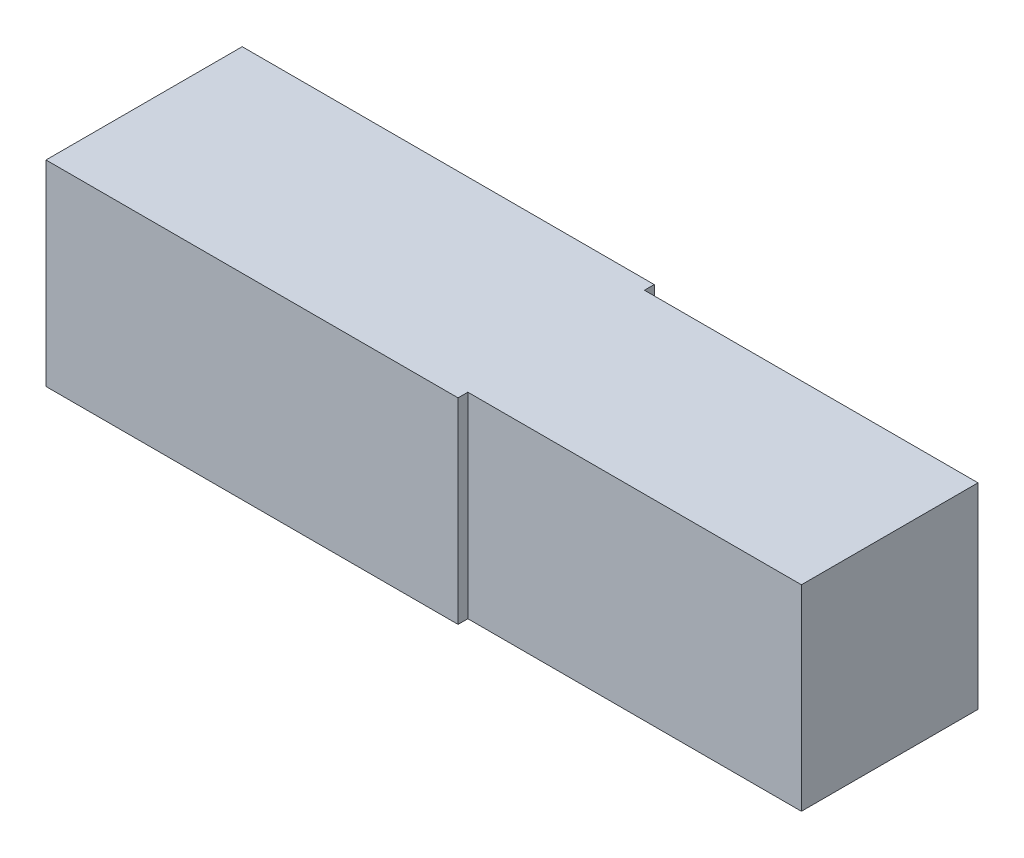
ISO-10303-21;
HEADER;
FILE_DESCRIPTION(('STEP AP214'),'2;1');
FILE_NAME('part.step','',(''),(''),'','','');
FILE_SCHEMA(('AUTOMOTIVE_DESIGN { 1 0 10303 214 1 1 1 1 }'));
ENDSEC;
DATA;
#1=APPLICATION_CONTEXT('core data for automotive mechanical design processes');
#2=APPLICATION_PROTOCOL_DEFINITION('international standard','automotive_design',2000,#1);
#3=PRODUCT_CONTEXT('',#1,'mechanical');
#4=PRODUCT('Part','Part','',(#3));
#5=PRODUCT_RELATED_PRODUCT_CATEGORY('part','',(#4));
#6=PRODUCT_DEFINITION_FORMATION('','',#4);
#7=PRODUCT_DEFINITION_CONTEXT('part definition',#1,'design');
#8=PRODUCT_DEFINITION('design','',#6,#7);
#9=PRODUCT_DEFINITION_SHAPE('','',#8);
#10=(LENGTH_UNIT() NAMED_UNIT(*) SI_UNIT(.MILLI.,.METRE.));
#11=(NAMED_UNIT(*) PLANE_ANGLE_UNIT() SI_UNIT($,.RADIAN.));
#12=(NAMED_UNIT(*) SI_UNIT($,.STERADIAN.) SOLID_ANGLE_UNIT());
#13=UNCERTAINTY_MEASURE_WITH_UNIT(LENGTH_MEASURE(1.E-05),#10,'distance_accuracy_value','');
#14=(GEOMETRIC_REPRESENTATION_CONTEXT(3) GLOBAL_UNCERTAINTY_ASSIGNED_CONTEXT((#13)) GLOBAL_UNIT_ASSIGNED_CONTEXT((#10,
#11,#12)) REPRESENTATION_CONTEXT('',''));
#15=CARTESIAN_POINT('',(0.,0.,0.));
#16=DIRECTION('',(0.,0.,1.));
#17=DIRECTION('',(1.,0.,0.));
#18=AXIS2_PLACEMENT_3D('',#15,#16,#17);
#19=CARTESIAN_POINT('',(-10.5,10.,5.));
#20=DIRECTION('',(-1.,0.,0.));
#21=DIRECTION('',(0.,0.,1.));
#22=AXIS2_PLACEMENT_3D('',#19,#20,#21);
#23=PLANE('',#22);
#24=DIRECTION('',(0.,0.,-1.));
#25=VECTOR('',#24,1.);
#26=CARTESIAN_POINT('',(-10.5,0.,5.));
#27=LINE('',#26,#25);
#28=CARTESIAN_POINT('',(-10.5,0.,5.));
#29=VERTEX_POINT('',#28);
#30=CARTESIAN_POINT('',(-10.5,0.,-5.));
#31=VERTEX_POINT('',#30);
#32=EDGE_CURVE('E104',#29,#31,#27,.T.);
#33=ORIENTED_EDGE('',*,*,#32,.F.);
#34=DIRECTION('',(0.,-1.,0.));
#35=VECTOR('',#34,1.);
#36=CARTESIAN_POINT('',(-10.5,10.,5.));
#37=LINE('',#36,#35);
#38=CARTESIAN_POINT('',(-10.5,10.,5.));
#39=VERTEX_POINT('',#38);
#40=EDGE_CURVE('E103',#39,#29,#37,.T.);
#41=ORIENTED_EDGE('',*,*,#40,.F.);
#42=DIRECTION('',(0.,0.,-1.));
#43=VECTOR('',#42,1.);
#44=CARTESIAN_POINT('',(-10.5,10.,5.));
#45=LINE('',#44,#43);
#46=CARTESIAN_POINT('',(-10.5,10.,-5.));
#47=VERTEX_POINT('',#46);
#48=EDGE_CURVE('E120',#39,#47,#45,.T.);
#49=ORIENTED_EDGE('',*,*,#48,.T.);
#50=DIRECTION('',(0.,-1.,0.));
#51=VECTOR('',#50,1.);
#52=CARTESIAN_POINT('',(-10.5,10.,-5.));
#53=LINE('',#52,#51);
#54=EDGE_CURVE('E129',#47,#31,#53,.T.);
#55=ORIENTED_EDGE('',*,*,#54,.T.);
#56=EDGE_LOOP('',(#33,#41,#49,#55));
#57=FACE_BOUND('',#56,.T.);
#58=ADVANCED_FACE('F39',(#57),#23,.T.);
#59=CARTESIAN_POINT('',(-10.5,10.,5.));
#60=DIRECTION('',(0.,0.,-1.));
#61=DIRECTION('',(-1.,0.,0.));
#62=AXIS2_PLACEMENT_3D('',#59,#60,#61);
#63=PLANE('',#62);
#64=DIRECTION('',(1.,0.,0.));
#65=VECTOR('',#64,1.);
#66=CARTESIAN_POINT('',(-10.5,0.,5.));
#67=LINE('',#66,#65);
#68=CARTESIAN_POINT('',(10.5,0.,5.));
#69=VERTEX_POINT('',#68);
#70=EDGE_CURVE('E117',#29,#69,#67,.T.);
#71=ORIENTED_EDGE('',*,*,#70,.T.);
#72=DIRECTION('',(0.,-1.,0.));
#73=VECTOR('',#72,1.);
#74=CARTESIAN_POINT('',(10.5,10.,5.));
#75=LINE('',#74,#73);
#76=CARTESIAN_POINT('',(10.5,10.,5.));
#77=VERTEX_POINT('',#76);
#78=EDGE_CURVE('E123',#77,#69,#75,.T.);
#79=ORIENTED_EDGE('',*,*,#78,.F.);
#80=DIRECTION('',(1.,0.,0.));
#81=VECTOR('',#80,1.);
#82=CARTESIAN_POINT('',(-10.5,10.,5.));
#83=LINE('',#82,#81);
#84=EDGE_CURVE('E111',#39,#77,#83,.T.);
#85=ORIENTED_EDGE('',*,*,#84,.F.);
#86=ORIENTED_EDGE('',*,*,#40,.T.);
#87=EDGE_LOOP('',(#71,#79,#85,#86));
#88=FACE_BOUND('',#87,.T.);
#89=ADVANCED_FACE('F152',(#88),#63,.F.);
#90=CARTESIAN_POINT('',(-10.5,10.,-5.));
#91=DIRECTION('',(0.,0.,-1.));
#92=DIRECTION('',(-1.,0.,0.));
#93=AXIS2_PLACEMENT_3D('',#90,#91,#92);
#94=PLANE('',#93);
#95=DIRECTION('',(1.,0.,0.));
#96=VECTOR('',#95,1.);
#97=CARTESIAN_POINT('',(-10.5,0.,-5.));
#98=LINE('',#97,#96);
#99=CARTESIAN_POINT('',(10.5,0.,-5.));
#100=VERTEX_POINT('',#99);
#101=EDGE_CURVE('E105',#31,#100,#98,.T.);
#102=ORIENTED_EDGE('',*,*,#101,.F.);
#103=ORIENTED_EDGE('',*,*,#54,.F.);
#104=DIRECTION('',(1.,0.,0.));
#105=VECTOR('',#104,1.);
#106=CARTESIAN_POINT('',(-10.5,10.,-5.));
#107=LINE('',#106,#105);
#108=CARTESIAN_POINT('',(10.5,10.,-5.));
#109=VERTEX_POINT('',#108);
#110=EDGE_CURVE('E174',#47,#109,#107,.T.);
#111=ORIENTED_EDGE('',*,*,#110,.T.);
#112=DIRECTION('',(0.,-1.,0.));
#113=VECTOR('',#112,1.);
#114=CARTESIAN_POINT('',(10.5,10.,-5.));
#115=LINE('',#114,#113);
#116=EDGE_CURVE('E126',#109,#100,#115,.T.);
#117=ORIENTED_EDGE('',*,*,#116,.T.);
#118=EDGE_LOOP('',(#102,#103,#111,#117));
#119=FACE_BOUND('',#118,.T.);
#120=ADVANCED_FACE('F183',(#119),#94,.T.);
#121=CARTESIAN_POINT('',(0.,0.,0.));
#122=DIRECTION('',(0.,-1.,0.));
#123=DIRECTION('',(0.,0.,-1.));
#124=AXIS2_PLACEMENT_3D('',#121,#122,#123);
#125=PLANE('',#124);
#126=ORIENTED_EDGE('',*,*,#32,.T.);
#127=ORIENTED_EDGE('',*,*,#101,.T.);
#128=DIRECTION('',(0.,0.,-1.));
#129=VECTOR('',#128,1.);
#130=CARTESIAN_POINT('',(10.5,0.,5.));
#131=LINE('',#130,#129);
#132=CARTESIAN_POINT('',(10.5,0.,-4.5));
#133=VERTEX_POINT('',#132);
#134=EDGE_CURVE('E96',#133,#100,#131,.T.);
#135=ORIENTED_EDGE('',*,*,#134,.F.);
#136=DIRECTION('',(1.,0.,0.));
#137=VECTOR('',#136,1.);
#138=CARTESIAN_POINT('',(10.5,0.,-4.5));
#139=LINE('',#138,#137);
#140=CARTESIAN_POINT('',(27.5,0.,-4.5));
#141=VERTEX_POINT('',#140);
#142=EDGE_CURVE('E80',#133,#141,#139,.T.);
#143=ORIENTED_EDGE('',*,*,#142,.T.);
#144=DIRECTION('',(0.,0.,1.));
#145=VECTOR('',#144,1.);
#146=CARTESIAN_POINT('',(27.5,0.,-4.5));
#147=LINE('',#146,#145);
#148=CARTESIAN_POINT('',(27.5,0.,4.5));
#149=VERTEX_POINT('',#148);
#150=EDGE_CURVE('E86',#141,#149,#147,.T.);
#151=ORIENTED_EDGE('',*,*,#150,.T.);
#152=DIRECTION('',(1.,0.,0.));
#153=VECTOR('',#152,1.);
#154=CARTESIAN_POINT('',(10.5,0.,4.5));
#155=LINE('',#154,#153);
#156=CARTESIAN_POINT('',(10.5,0.,4.5));
#157=VERTEX_POINT('',#156);
#158=EDGE_CURVE('E90',#157,#149,#155,.T.);
#159=ORIENTED_EDGE('',*,*,#158,.F.);
#160=EDGE_CURVE('E114',#69,#157,#131,.T.);
#161=ORIENTED_EDGE('',*,*,#160,.F.);
#162=ORIENTED_EDGE('',*,*,#70,.F.);
#163=EDGE_LOOP('',(#126,#127,#135,#143,#151,#159,#161,#162));
#164=FACE_BOUND('',#163,.T.);
#165=ADVANCED_FACE('F93',(#164),#125,.T.);
#166=CARTESIAN_POINT('',(0.,10.,0.));
#167=DIRECTION('',(0.,-1.,0.));
#168=DIRECTION('',(0.,0.,-1.));
#169=AXIS2_PLACEMENT_3D('',#166,#167,#168);
#170=PLANE('',#169);
#171=ORIENTED_EDGE('',*,*,#48,.F.);
#172=ORIENTED_EDGE('',*,*,#84,.T.);
#173=DIRECTION('',(0.,0.,-1.));
#174=VECTOR('',#173,1.);
#175=CARTESIAN_POINT('',(10.5,10.,5.));
#176=LINE('',#175,#174);
#177=CARTESIAN_POINT('',(10.5,10.,4.5));
#178=VERTEX_POINT('',#177);
#179=EDGE_CURVE('E146',#77,#178,#176,.T.);
#180=ORIENTED_EDGE('',*,*,#179,.T.);
#181=DIRECTION('',(1.,0.,0.));
#182=VECTOR('',#181,1.);
#183=CARTESIAN_POINT('',(10.5,10.,4.5));
#184=LINE('',#183,#182);
#185=CARTESIAN_POINT('',(27.5,10.,4.5));
#186=VERTEX_POINT('',#185);
#187=EDGE_CURVE('E97',#178,#186,#184,.T.);
#188=ORIENTED_EDGE('',*,*,#187,.T.);
#189=DIRECTION('',(0.,0.,1.));
#190=VECTOR('',#189,1.);
#191=CARTESIAN_POINT('',(27.5,10.,-4.5));
#192=LINE('',#191,#190);
#193=CARTESIAN_POINT('',(27.5,10.,-4.5));
#194=VERTEX_POINT('',#193);
#195=EDGE_CURVE('E99',#194,#186,#192,.T.);
#196=ORIENTED_EDGE('',*,*,#195,.F.);
#197=DIRECTION('',(1.,0.,0.));
#198=VECTOR('',#197,1.);
#199=CARTESIAN_POINT('',(10.5,10.,-4.5));
#200=LINE('',#199,#198);
#201=CARTESIAN_POINT('',(10.5,10.,-4.5));
#202=VERTEX_POINT('',#201);
#203=EDGE_CURVE('E82',#202,#194,#200,.T.);
#204=ORIENTED_EDGE('',*,*,#203,.F.);
#205=EDGE_CURVE('E171',#202,#109,#176,.T.);
#206=ORIENTED_EDGE('',*,*,#205,.T.);
#207=ORIENTED_EDGE('',*,*,#110,.F.);
#208=EDGE_LOOP('',(#171,#172,#180,#188,#196,#204,#206,#207));
#209=FACE_BOUND('',#208,.T.);
#210=ADVANCED_FACE('F181',(#209),#170,.F.);
#211=CARTESIAN_POINT('',(10.5,10.,5.));
#212=DIRECTION('',(-1.,0.,0.));
#213=DIRECTION('',(0.,0.,1.));
#214=AXIS2_PLACEMENT_3D('',#211,#212,#213);
#215=PLANE('',#214);
#216=ORIENTED_EDGE('',*,*,#205,.F.);
#217=DIRECTION('',(0.,-1.,0.));
#218=VECTOR('',#217,1.);
#219=CARTESIAN_POINT('',(10.5,10.,-4.5));
#220=LINE('',#219,#218);
#221=EDGE_CURVE('E48',#202,#133,#220,.T.);
#222=ORIENTED_EDGE('',*,*,#221,.T.);
#223=ORIENTED_EDGE('',*,*,#134,.T.);
#224=ORIENTED_EDGE('',*,*,#116,.F.);
#225=EDGE_LOOP('',(#216,#222,#223,#224));
#226=FACE_BOUND('',#225,.T.);
#227=ADVANCED_FACE('F169',(#226),#215,.F.);
#228=DIRECTION('',(0.,-1.,0.));
#229=VECTOR('',#228,1.);
#230=CARTESIAN_POINT('',(10.5,10.,4.5));
#231=LINE('',#230,#229);
#232=EDGE_CURVE('E11',#178,#157,#231,.T.);
#233=ORIENTED_EDGE('',*,*,#232,.F.);
#234=ORIENTED_EDGE('',*,*,#179,.F.);
#235=ORIENTED_EDGE('',*,*,#78,.T.);
#236=ORIENTED_EDGE('',*,*,#160,.T.);
#237=EDGE_LOOP('',(#233,#234,#235,#236));
#238=FACE_BOUND('',#237,.T.);
#239=ADVANCED_FACE('F141',(#238),#215,.F.);
#240=CARTESIAN_POINT('',(27.5,10.,-4.5));
#241=DIRECTION('',(1.,0.,0.));
#242=DIRECTION('',(0.,0.,-1.));
#243=AXIS2_PLACEMENT_3D('',#240,#241,#242);
#244=PLANE('',#243);
#245=ORIENTED_EDGE('',*,*,#150,.F.);
#246=DIRECTION('',(0.,-1.,0.));
#247=VECTOR('',#246,1.);
#248=CARTESIAN_POINT('',(27.5,10.,-4.5));
#249=LINE('',#248,#247);
#250=EDGE_CURVE('E77',#194,#141,#249,.T.);
#251=ORIENTED_EDGE('',*,*,#250,.F.);
#252=ORIENTED_EDGE('',*,*,#195,.T.);
#253=DIRECTION('',(0.,-1.,0.));
#254=VECTOR('',#253,1.);
#255=CARTESIAN_POINT('',(27.5,10.,4.5));
#256=LINE('',#255,#254);
#257=EDGE_CURVE('E74',#186,#149,#256,.T.);
#258=ORIENTED_EDGE('',*,*,#257,.T.);
#259=EDGE_LOOP('',(#245,#251,#252,#258));
#260=FACE_BOUND('',#259,.T.);
#261=ADVANCED_FACE('F87',(#260),#244,.T.);
#262=CARTESIAN_POINT('',(10.5,10.,-4.5));
#263=DIRECTION('',(0.,0.,-1.));
#264=DIRECTION('',(-1.,0.,0.));
#265=AXIS2_PLACEMENT_3D('',#262,#263,#264);
#266=PLANE('',#265);
#267=ORIENTED_EDGE('',*,*,#142,.F.);
#268=ORIENTED_EDGE('',*,*,#221,.F.);
#269=ORIENTED_EDGE('',*,*,#203,.T.);
#270=ORIENTED_EDGE('',*,*,#250,.T.);
#271=EDGE_LOOP('',(#267,#268,#269,#270));
#272=FACE_BOUND('',#271,.T.);
#273=ADVANCED_FACE('F78',(#272),#266,.T.);
#274=CARTESIAN_POINT('',(10.5,10.,4.5));
#275=DIRECTION('',(0.,0.,-1.));
#276=DIRECTION('',(-1.,0.,0.));
#277=AXIS2_PLACEMENT_3D('',#274,#275,#276);
#278=PLANE('',#277);
#279=ORIENTED_EDGE('',*,*,#158,.T.);
#280=ORIENTED_EDGE('',*,*,#257,.F.);
#281=ORIENTED_EDGE('',*,*,#187,.F.);
#282=ORIENTED_EDGE('',*,*,#232,.T.);
#283=EDGE_LOOP('',(#279,#280,#281,#282));
#284=FACE_BOUND('',#283,.T.);
#285=ADVANCED_FACE('F41',(#284),#278,.F.);
#286=CLOSED_SHELL('',(#58,#89,#120,#165,#210,#227,#239,#261,#273,#285));
#287=MANIFOLD_SOLID_BREP('B2',#286);
#288=ADVANCED_BREP_SHAPE_REPRESENTATION('',(#18,#287),#14);
#289=SHAPE_DEFINITION_REPRESENTATION(#9,#288);
ENDSEC;
END-ISO-10303-21;
